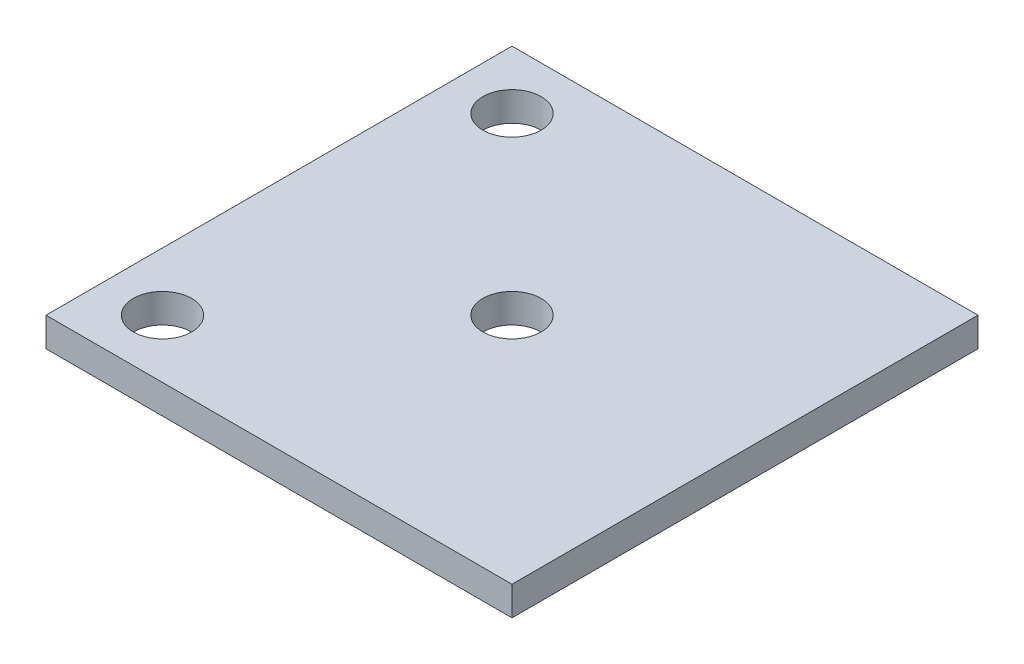
ISO-10303-21;
HEADER;
FILE_DESCRIPTION(('STEP AP214'),'2;1');
FILE_NAME('part.step','',(''),(''),'','','');
FILE_SCHEMA(('AUTOMOTIVE_DESIGN { 1 0 10303 214 1 1 1 1 }'));
ENDSEC;
DATA;
#1=APPLICATION_CONTEXT('core data for automotive mechanical design processes');
#2=APPLICATION_PROTOCOL_DEFINITION('international standard','automotive_design',2000,#1);
#3=PRODUCT_CONTEXT('',#1,'mechanical');
#4=PRODUCT('Part','Part','',(#3));
#5=PRODUCT_RELATED_PRODUCT_CATEGORY('part','',(#4));
#6=PRODUCT_DEFINITION_FORMATION('','',#4);
#7=PRODUCT_DEFINITION_CONTEXT('part definition',#1,'design');
#8=PRODUCT_DEFINITION('design','',#6,#7);
#9=PRODUCT_DEFINITION_SHAPE('','',#8);
#10=(LENGTH_UNIT() NAMED_UNIT(*) SI_UNIT(.MILLI.,.METRE.));
#11=(NAMED_UNIT(*) PLANE_ANGLE_UNIT() SI_UNIT($,.RADIAN.));
#12=(NAMED_UNIT(*) SI_UNIT($,.STERADIAN.) SOLID_ANGLE_UNIT());
#13=UNCERTAINTY_MEASURE_WITH_UNIT(LENGTH_MEASURE(1.E-05),#10,'distance_accuracy_value','');
#14=(GEOMETRIC_REPRESENTATION_CONTEXT(3) GLOBAL_UNCERTAINTY_ASSIGNED_CONTEXT((#13)) GLOBAL_UNIT_ASSIGNED_CONTEXT((#10,
#11,#12)) REPRESENTATION_CONTEXT('',''));
#15=CARTESIAN_POINT('',(0.,0.,0.));
#16=DIRECTION('',(0.,0.,1.));
#17=DIRECTION('',(1.,0.,0.));
#18=AXIS2_PLACEMENT_3D('',#15,#16,#17);
#19=CARTESIAN_POINT('',(0.,3.175,0.));
#20=DIRECTION('',(1.,0.,0.));
#21=DIRECTION('',(0.,0.,-1.));
#22=AXIS2_PLACEMENT_3D('',#19,#20,#21);
#23=PLANE('',#22);
#24=DIRECTION('',(0.,0.,1.));
#25=VECTOR('',#24,1.);
#26=CARTESIAN_POINT('',(0.,0.,0.));
#27=LINE('',#26,#25);
#28=CARTESIAN_POINT('',(0.,0.,-50.8));
#29=VERTEX_POINT('',#28);
#30=CARTESIAN_POINT('',(0.,0.,0.));
#31=VERTEX_POINT('',#30);
#32=EDGE_CURVE('E95',#29,#31,#27,.T.);
#33=ORIENTED_EDGE('',*,*,#32,.T.);
#34=DIRECTION('',(0.,-1.,0.));
#35=VECTOR('',#34,1.);
#36=CARTESIAN_POINT('',(0.,3.175,0.));
#37=LINE('',#36,#35);
#38=CARTESIAN_POINT('',(0.,3.175,0.));
#39=VERTEX_POINT('',#38);
#40=EDGE_CURVE('E11',#39,#31,#37,.T.);
#41=ORIENTED_EDGE('',*,*,#40,.F.);
#42=DIRECTION('',(0.,0.,1.));
#43=VECTOR('',#42,1.);
#44=CARTESIAN_POINT('',(0.,3.175,0.));
#45=LINE('',#44,#43);
#46=CARTESIAN_POINT('',(0.,3.175,-50.8));
#47=VERTEX_POINT('',#46);
#48=EDGE_CURVE('E83',#47,#39,#45,.T.);
#49=ORIENTED_EDGE('',*,*,#48,.F.);
#50=DIRECTION('',(0.,-1.,0.));
#51=VECTOR('',#50,1.);
#52=CARTESIAN_POINT('',(0.,3.175,-50.8));
#53=LINE('',#52,#51);
#54=EDGE_CURVE('E91',#47,#29,#53,.T.);
#55=ORIENTED_EDGE('',*,*,#54,.T.);
#56=EDGE_LOOP('',(#33,#41,#49,#55));
#57=FACE_BOUND('',#56,.T.);
#58=ADVANCED_FACE('F32',(#57),#23,.F.);
#59=CARTESIAN_POINT('',(0.,3.175,0.));
#60=DIRECTION('',(0.,0.,-1.));
#61=DIRECTION('',(-1.,0.,0.));
#62=AXIS2_PLACEMENT_3D('',#59,#60,#61);
#63=PLANE('',#62);
#64=DIRECTION('',(1.,0.,0.));
#65=VECTOR('',#64,1.);
#66=CARTESIAN_POINT('',(0.,0.,0.));
#67=LINE('',#66,#65);
#68=CARTESIAN_POINT('',(50.8,0.,0.));
#69=VERTEX_POINT('',#68);
#70=EDGE_CURVE('E87',#31,#69,#67,.T.);
#71=ORIENTED_EDGE('',*,*,#70,.T.);
#72=DIRECTION('',(0.,-1.,0.));
#73=VECTOR('',#72,1.);
#74=CARTESIAN_POINT('',(50.8,3.175,0.));
#75=LINE('',#74,#73);
#76=CARTESIAN_POINT('',(50.8,3.175,0.));
#77=VERTEX_POINT('',#76);
#78=EDGE_CURVE('E40',#77,#69,#75,.T.);
#79=ORIENTED_EDGE('',*,*,#78,.F.);
#80=DIRECTION('',(1.,0.,0.));
#81=VECTOR('',#80,1.);
#82=CARTESIAN_POINT('',(0.,3.175,0.));
#83=LINE('',#82,#81);
#84=EDGE_CURVE('E78',#39,#77,#83,.T.);
#85=ORIENTED_EDGE('',*,*,#84,.F.);
#86=ORIENTED_EDGE('',*,*,#40,.T.);
#87=EDGE_LOOP('',(#71,#79,#85,#86));
#88=FACE_BOUND('',#87,.T.);
#89=ADVANCED_FACE('F86',(#88),#63,.F.);
#90=CARTESIAN_POINT('',(50.8,3.175,0.));
#91=DIRECTION('',(-1.,0.,0.));
#92=DIRECTION('',(0.,0.,1.));
#93=AXIS2_PLACEMENT_3D('',#90,#91,#92);
#94=PLANE('',#93);
#95=DIRECTION('',(0.,0.,-1.));
#96=VECTOR('',#95,1.);
#97=CARTESIAN_POINT('',(50.8,0.,0.));
#98=LINE('',#97,#96);
#99=CARTESIAN_POINT('',(50.8,0.,-50.8));
#100=VERTEX_POINT('',#99);
#101=EDGE_CURVE('E65',#69,#100,#98,.T.);
#102=ORIENTED_EDGE('',*,*,#101,.T.);
#103=DIRECTION('',(0.,-1.,0.));
#104=VECTOR('',#103,1.);
#105=CARTESIAN_POINT('',(50.8,3.175,-50.8));
#106=LINE('',#105,#104);
#107=CARTESIAN_POINT('',(50.8,3.175,-50.8));
#108=VERTEX_POINT('',#107);
#109=EDGE_CURVE('E88',#108,#100,#106,.T.);
#110=ORIENTED_EDGE('',*,*,#109,.F.);
#111=DIRECTION('',(0.,0.,-1.));
#112=VECTOR('',#111,1.);
#113=CARTESIAN_POINT('',(50.8,3.175,0.));
#114=LINE('',#113,#112);
#115=EDGE_CURVE('E81',#77,#108,#114,.T.);
#116=ORIENTED_EDGE('',*,*,#115,.F.);
#117=ORIENTED_EDGE('',*,*,#78,.T.);
#118=EDGE_LOOP('',(#102,#110,#116,#117));
#119=FACE_BOUND('',#118,.T.);
#120=ADVANCED_FACE('F89',(#119),#94,.F.);
#121=CARTESIAN_POINT('',(0.,3.175,-50.8));
#122=DIRECTION('',(0.,0.,1.));
#123=DIRECTION('',(1.,0.,0.));
#124=AXIS2_PLACEMENT_3D('',#121,#122,#123);
#125=PLANE('',#124);
#126=DIRECTION('',(-1.,0.,0.));
#127=VECTOR('',#126,1.);
#128=CARTESIAN_POINT('',(0.,0.,-50.8));
#129=LINE('',#128,#127);
#130=EDGE_CURVE('E71',#100,#29,#129,.T.);
#131=ORIENTED_EDGE('',*,*,#130,.T.);
#132=ORIENTED_EDGE('',*,*,#54,.F.);
#133=DIRECTION('',(-1.,0.,0.));
#134=VECTOR('',#133,1.);
#135=CARTESIAN_POINT('',(0.,3.175,-50.8));
#136=LINE('',#135,#134);
#137=EDGE_CURVE('E48',#108,#47,#136,.T.);
#138=ORIENTED_EDGE('',*,*,#137,.F.);
#139=ORIENTED_EDGE('',*,*,#109,.T.);
#140=EDGE_LOOP('',(#131,#132,#138,#139));
#141=FACE_BOUND('',#140,.T.);
#142=ADVANCED_FACE('F103',(#141),#125,.F.);
#143=CARTESIAN_POINT('',(0.,3.175,0.));
#144=DIRECTION('',(0.,-1.,0.));
#145=DIRECTION('',(0.,0.,-1.));
#146=AXIS2_PLACEMENT_3D('',#143,#144,#145);
#147=PLANE('',#146);
#148=CARTESIAN_POINT('',(6.35,3.175,-6.35));
#149=DIRECTION('',(0.,1.,0.));
#150=DIRECTION('',(0.,0.,1.));
#151=AXIS2_PLACEMENT_3D('',#148,#149,#150);
#152=CIRCLE('',#151,3.175);
#153=CARTESIAN_POINT('',(6.35,3.175,-3.175));
#154=VERTEX_POINT('',#153);
#155=EDGE_CURVE('E121',#154,#154,#152,.T.);
#156=ORIENTED_EDGE('',*,*,#155,.F.);
#157=EDGE_LOOP('',(#156));
#158=FACE_BOUND('',#157,.T.);
#159=CARTESIAN_POINT('',(6.35,3.175,-44.45));
#160=DIRECTION('',(0.,1.,0.));
#161=DIRECTION('',(0.,0.,1.));
#162=AXIS2_PLACEMENT_3D('',#159,#160,#161);
#163=CIRCLE('',#162,3.175);
#164=CARTESIAN_POINT('',(6.35,3.175,-41.275));
#165=VERTEX_POINT('',#164);
#166=EDGE_CURVE('E115',#165,#165,#163,.T.);
#167=ORIENTED_EDGE('',*,*,#166,.F.);
#168=EDGE_LOOP('',(#167));
#169=FACE_BOUND('',#168,.T.);
#170=CARTESIAN_POINT('',(25.4,3.175,-25.4));
#171=DIRECTION('',(0.,1.,0.));
#172=DIRECTION('',(0.,0.,1.));
#173=AXIS2_PLACEMENT_3D('',#170,#171,#172);
#174=CIRCLE('',#173,3.175);
#175=CARTESIAN_POINT('',(25.4,3.175,-22.225));
#176=VERTEX_POINT('',#175);
#177=EDGE_CURVE('E109',#176,#176,#174,.T.);
#178=ORIENTED_EDGE('',*,*,#177,.F.);
#179=EDGE_LOOP('',(#178));
#180=FACE_BOUND('',#179,.T.);
#181=ORIENTED_EDGE('',*,*,#48,.T.);
#182=ORIENTED_EDGE('',*,*,#84,.T.);
#183=ORIENTED_EDGE('',*,*,#115,.T.);
#184=ORIENTED_EDGE('',*,*,#137,.T.);
#185=EDGE_LOOP('',(#181,#182,#183,#184));
#186=FACE_BOUND('',#185,.T.);
#187=ADVANCED_FACE('F79',(#158,#169,#180,#186),#147,.F.);
#188=CARTESIAN_POINT('',(0.,0.,0.));
#189=DIRECTION('',(0.,-1.,0.));
#190=DIRECTION('',(0.,0.,-1.));
#191=AXIS2_PLACEMENT_3D('',#188,#189,#190);
#192=PLANE('',#191);
#193=CARTESIAN_POINT('',(6.35,0.,-6.35));
#194=DIRECTION('',(0.,1.,0.));
#195=DIRECTION('',(0.,0.,1.));
#196=AXIS2_PLACEMENT_3D('',#193,#194,#195);
#197=CIRCLE('',#196,3.175);
#198=CARTESIAN_POINT('',(6.35,0.,-3.175));
#199=VERTEX_POINT('',#198);
#200=EDGE_CURVE('E118',#199,#199,#197,.T.);
#201=ORIENTED_EDGE('',*,*,#200,.T.);
#202=EDGE_LOOP('',(#201));
#203=FACE_BOUND('',#202,.T.);
#204=CARTESIAN_POINT('',(6.35,0.,-44.45));
#205=DIRECTION('',(0.,1.,0.));
#206=DIRECTION('',(0.,0.,1.));
#207=AXIS2_PLACEMENT_3D('',#204,#205,#206);
#208=CIRCLE('',#207,3.175);
#209=CARTESIAN_POINT('',(6.35,0.,-41.275));
#210=VERTEX_POINT('',#209);
#211=EDGE_CURVE('E112',#210,#210,#208,.T.);
#212=ORIENTED_EDGE('',*,*,#211,.T.);
#213=EDGE_LOOP('',(#212));
#214=FACE_BOUND('',#213,.T.);
#215=CARTESIAN_POINT('',(25.4,0.,-25.4));
#216=DIRECTION('',(0.,1.,0.));
#217=DIRECTION('',(0.,0.,1.));
#218=AXIS2_PLACEMENT_3D('',#215,#216,#217);
#219=CIRCLE('',#218,3.175);
#220=CARTESIAN_POINT('',(25.4,0.,-22.225));
#221=VERTEX_POINT('',#220);
#222=EDGE_CURVE('E98',#221,#221,#219,.T.);
#223=ORIENTED_EDGE('',*,*,#222,.T.);
#224=EDGE_LOOP('',(#223));
#225=FACE_BOUND('',#224,.T.);
#226=ORIENTED_EDGE('',*,*,#32,.F.);
#227=ORIENTED_EDGE('',*,*,#130,.F.);
#228=ORIENTED_EDGE('',*,*,#101,.F.);
#229=ORIENTED_EDGE('',*,*,#70,.F.);
#230=EDGE_LOOP('',(#226,#227,#228,#229));
#231=FACE_BOUND('',#230,.T.);
#232=ADVANCED_FACE('F106',(#203,#214,#225,#231),#192,.T.);
#233=CARTESIAN_POINT('',(25.4,0.,-25.4));
#234=DIRECTION('',(0.,1.,0.));
#235=DIRECTION('',(0.,0.,1.));
#236=AXIS2_PLACEMENT_3D('',#233,#234,#235);
#237=CYLINDRICAL_SURFACE('',#236,3.175);
#238=ORIENTED_EDGE('',*,*,#222,.F.);
#239=EDGE_LOOP('',(#238));
#240=FACE_BOUND('',#239,.T.);
#241=ORIENTED_EDGE('',*,*,#177,.T.);
#242=EDGE_LOOP('',(#241));
#243=FACE_BOUND('',#242,.T.);
#244=ADVANCED_FACE('F143',(#240,#243),#237,.F.);
#245=CARTESIAN_POINT('',(6.35,0.,-44.45));
#246=DIRECTION('',(0.,1.,0.));
#247=DIRECTION('',(0.,0.,1.));
#248=AXIS2_PLACEMENT_3D('',#245,#246,#247);
#249=CYLINDRICAL_SURFACE('',#248,3.175);
#250=ORIENTED_EDGE('',*,*,#211,.F.);
#251=EDGE_LOOP('',(#250));
#252=FACE_BOUND('',#251,.T.);
#253=ORIENTED_EDGE('',*,*,#166,.T.);
#254=EDGE_LOOP('',(#253));
#255=FACE_BOUND('',#254,.T.);
#256=ADVANCED_FACE('F132',(#252,#255),#249,.F.);
#257=CARTESIAN_POINT('',(6.35,0.,-6.35));
#258=DIRECTION('',(0.,1.,0.));
#259=DIRECTION('',(0.,0.,1.));
#260=AXIS2_PLACEMENT_3D('',#257,#258,#259);
#261=CYLINDRICAL_SURFACE('',#260,3.175);
#262=ORIENTED_EDGE('',*,*,#200,.F.);
#263=EDGE_LOOP('',(#262));
#264=FACE_BOUND('',#263,.T.);
#265=ORIENTED_EDGE('',*,*,#155,.T.);
#266=EDGE_LOOP('',(#265));
#267=FACE_BOUND('',#266,.T.);
#268=ADVANCED_FACE('F129',(#264,#267),#261,.F.);
#269=CLOSED_SHELL('',(#58,#89,#120,#142,#187,#232,#244,#256,#268));
#270=MANIFOLD_SOLID_BREP('B2',#269);
#271=ADVANCED_BREP_SHAPE_REPRESENTATION('',(#18,#270),#14);
#272=SHAPE_DEFINITION_REPRESENTATION(#9,#271);
ENDSEC;
END-ISO-10303-21;
